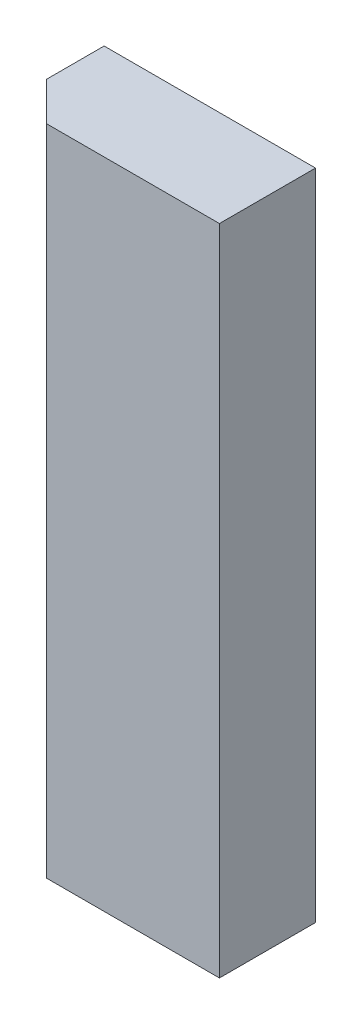
ISO-10303-21;
HEADER;
FILE_DESCRIPTION(('STEP AP214'),'2;1');
FILE_NAME('part.step','',(''),(''),'','','');
FILE_SCHEMA(('AUTOMOTIVE_DESIGN { 1 0 10303 214 1 1 1 1 }'));
ENDSEC;
DATA;
#1=APPLICATION_CONTEXT('core data for automotive mechanical design processes');
#2=APPLICATION_PROTOCOL_DEFINITION('international standard','automotive_design',2000,#1);
#3=PRODUCT_CONTEXT('',#1,'mechanical');
#4=PRODUCT('Part','Part','',(#3));
#5=PRODUCT_RELATED_PRODUCT_CATEGORY('part','',(#4));
#6=PRODUCT_DEFINITION_FORMATION('','',#4);
#7=PRODUCT_DEFINITION_CONTEXT('part definition',#1,'design');
#8=PRODUCT_DEFINITION('design','',#6,#7);
#9=PRODUCT_DEFINITION_SHAPE('','',#8);
#10=(LENGTH_UNIT() NAMED_UNIT(*) SI_UNIT(.MILLI.,.METRE.));
#11=(NAMED_UNIT(*) PLANE_ANGLE_UNIT() SI_UNIT($,.RADIAN.));
#12=(NAMED_UNIT(*) SI_UNIT($,.STERADIAN.) SOLID_ANGLE_UNIT());
#13=UNCERTAINTY_MEASURE_WITH_UNIT(LENGTH_MEASURE(1.E-05),#10,'distance_accuracy_value','');
#14=(GEOMETRIC_REPRESENTATION_CONTEXT(3) GLOBAL_UNCERTAINTY_ASSIGNED_CONTEXT((#13)) GLOBAL_UNIT_ASSIGNED_CONTEXT((#10,
#11,#12)) REPRESENTATION_CONTEXT('',''));
#15=CARTESIAN_POINT('',(0.,0.,0.));
#16=DIRECTION('',(0.,0.,1.));
#17=DIRECTION('',(1.,0.,0.));
#18=AXIS2_PLACEMENT_3D('',#15,#16,#17);
#19=CARTESIAN_POINT('',(0.,0.,25.));
#20=DIRECTION('',(0.,1.,0.));
#21=DIRECTION('',(0.,0.,1.));
#22=AXIS2_PLACEMENT_3D('',#19,#20,#21);
#23=PLANE('',#22);
#24=DIRECTION('',(1.,0.,0.));
#25=VECTOR('',#24,1.);
#26=CARTESIAN_POINT('',(0.,0.,25.));
#27=LINE('',#26,#25);
#28=CARTESIAN_POINT('',(-45.,0.,25.));
#29=VERTEX_POINT('',#28);
#30=CARTESIAN_POINT('',(0.,0.,25.));
#31=VERTEX_POINT('',#30);
#32=EDGE_CURVE('E86',#29,#31,#27,.T.);
#33=ORIENTED_EDGE('',*,*,#32,.F.);
#34=DIRECTION('',(0.707106781186547,0.,0.707106781186549));
#35=VECTOR('',#34,1.);
#36=CARTESIAN_POINT('',(-45.,0.,25.));
#37=LINE('',#36,#35);
#38=CARTESIAN_POINT('',(-55.,0.,15.));
#39=VERTEX_POINT('',#38);
#40=EDGE_CURVE('E64',#29,#39,#37,.F.);
#41=ORIENTED_EDGE('',*,*,#40,.T.);
#42=DIRECTION('',(0.,0.,-1.));
#43=VECTOR('',#42,1.);
#44=CARTESIAN_POINT('',(-55.,0.,25.));
#45=LINE('',#44,#43);
#46=CARTESIAN_POINT('',(-55.,0.,0.));
#47=VERTEX_POINT('',#46);
#48=EDGE_CURVE('E116',#39,#47,#45,.T.);
#49=ORIENTED_EDGE('',*,*,#48,.T.);
#50=DIRECTION('',(1.,0.,0.));
#51=VECTOR('',#50,1.);
#52=CARTESIAN_POINT('',(0.,0.,0.));
#53=LINE('',#52,#51);
#54=CARTESIAN_POINT('',(0.,0.,0.));
#55=VERTEX_POINT('',#54);
#56=EDGE_CURVE('E108',#47,#55,#53,.T.);
#57=ORIENTED_EDGE('',*,*,#56,.T.);
#58=DIRECTION('',(0.,0.,-1.));
#59=VECTOR('',#58,1.);
#60=CARTESIAN_POINT('',(0.,0.,25.));
#61=LINE('',#60,#59);
#62=EDGE_CURVE('E100',#31,#55,#61,.T.);
#63=ORIENTED_EDGE('',*,*,#62,.F.);
#64=EDGE_LOOP('',(#33,#41,#49,#57,#63));
#65=FACE_BOUND('',#64,.T.);
#66=ADVANCED_FACE('F41',(#65),#23,.F.);
#67=CARTESIAN_POINT('',(0.,0.,25.));
#68=DIRECTION('',(-1.,0.,0.));
#69=DIRECTION('',(0.,0.,1.));
#70=AXIS2_PLACEMENT_3D('',#67,#68,#69);
#71=PLANE('',#70);
#72=DIRECTION('',(0.,1.,0.));
#73=VECTOR('',#72,1.);
#74=CARTESIAN_POINT('',(0.,0.,0.));
#75=LINE('',#74,#73);
#76=CARTESIAN_POINT('',(0.,170.,0.));
#77=VERTEX_POINT('',#76);
#78=EDGE_CURVE('E123',#55,#77,#75,.T.);
#79=ORIENTED_EDGE('',*,*,#78,.T.);
#80=DIRECTION('',(0.,0.,-1.));
#81=VECTOR('',#80,1.);
#82=CARTESIAN_POINT('',(0.,170.,25.));
#83=LINE('',#82,#81);
#84=CARTESIAN_POINT('',(0.,170.,25.));
#85=VERTEX_POINT('',#84);
#86=EDGE_CURVE('E103',#85,#77,#83,.T.);
#87=ORIENTED_EDGE('',*,*,#86,.F.);
#88=DIRECTION('',(0.,1.,0.));
#89=VECTOR('',#88,1.);
#90=CARTESIAN_POINT('',(0.,0.,25.));
#91=LINE('',#90,#89);
#92=EDGE_CURVE('E90',#31,#85,#91,.T.);
#93=ORIENTED_EDGE('',*,*,#92,.F.);
#94=ORIENTED_EDGE('',*,*,#62,.T.);
#95=EDGE_LOOP('',(#79,#87,#93,#94));
#96=FACE_BOUND('',#95,.T.);
#97=ADVANCED_FACE('F99',(#96),#71,.F.);
#98=CARTESIAN_POINT('',(0.,170.,25.));
#99=DIRECTION('',(0.,-1.,0.));
#100=DIRECTION('',(0.,0.,-1.));
#101=AXIS2_PLACEMENT_3D('',#98,#99,#100);
#102=PLANE('',#101);
#103=DIRECTION('',(0.,0.,-1.));
#104=VECTOR('',#103,1.);
#105=CARTESIAN_POINT('',(-55.,170.,25.));
#106=LINE('',#105,#104);
#107=CARTESIAN_POINT('',(-55.,170.,15.));
#108=VERTEX_POINT('',#107);
#109=CARTESIAN_POINT('',(-55.,170.,0.));
#110=VERTEX_POINT('',#109);
#111=EDGE_CURVE('E111',#108,#110,#106,.T.);
#112=ORIENTED_EDGE('',*,*,#111,.F.);
#113=DIRECTION('',(-0.707106781186547,0.,-0.707106781186549));
#114=VECTOR('',#113,1.);
#115=CARTESIAN_POINT('',(-45.,170.,25.));
#116=LINE('',#115,#114);
#117=CARTESIAN_POINT('',(-45.,170.,25.));
#118=VERTEX_POINT('',#117);
#119=EDGE_CURVE('E11',#108,#118,#116,.F.);
#120=ORIENTED_EDGE('',*,*,#119,.T.);
#121=DIRECTION('',(-1.,0.,0.));
#122=VECTOR('',#121,1.);
#123=CARTESIAN_POINT('',(0.,170.,25.));
#124=LINE('',#123,#122);
#125=EDGE_CURVE('E105',#85,#118,#124,.T.);
#126=ORIENTED_EDGE('',*,*,#125,.F.);
#127=ORIENTED_EDGE('',*,*,#86,.T.);
#128=DIRECTION('',(-1.,0.,0.));
#129=VECTOR('',#128,1.);
#130=CARTESIAN_POINT('',(0.,170.,0.));
#131=LINE('',#130,#129);
#132=EDGE_CURVE('E120',#77,#110,#131,.T.);
#133=ORIENTED_EDGE('',*,*,#132,.T.);
#134=EDGE_LOOP('',(#112,#120,#126,#127,#133));
#135=FACE_BOUND('',#134,.T.);
#136=ADVANCED_FACE('F129',(#135),#102,.F.);
#137=CARTESIAN_POINT('',(-55.,0.,25.));
#138=DIRECTION('',(1.,0.,0.));
#139=DIRECTION('',(0.,0.,-1.));
#140=AXIS2_PLACEMENT_3D('',#137,#138,#139);
#141=PLANE('',#140);
#142=ORIENTED_EDGE('',*,*,#48,.F.);
#143=DIRECTION('',(0.,1.,0.));
#144=VECTOR('',#143,1.);
#145=CARTESIAN_POINT('',(-55.,0.,15.));
#146=LINE('',#145,#144);
#147=EDGE_CURVE('E50',#39,#108,#146,.T.);
#148=ORIENTED_EDGE('',*,*,#147,.T.);
#149=ORIENTED_EDGE('',*,*,#111,.T.);
#150=DIRECTION('',(0.,-1.,0.));
#151=VECTOR('',#150,1.);
#152=CARTESIAN_POINT('',(-55.,0.,0.));
#153=LINE('',#152,#151);
#154=EDGE_CURVE('E95',#110,#47,#153,.T.);
#155=ORIENTED_EDGE('',*,*,#154,.T.);
#156=EDGE_LOOP('',(#142,#148,#149,#155));
#157=FACE_BOUND('',#156,.T.);
#158=ADVANCED_FACE('F132',(#157),#141,.F.);
#159=CARTESIAN_POINT('',(0.,0.,25.));
#160=DIRECTION('',(0.,0.,-1.));
#161=DIRECTION('',(-1.,0.,0.));
#162=AXIS2_PLACEMENT_3D('',#159,#160,#161);
#163=PLANE('',#162);
#164=ORIENTED_EDGE('',*,*,#125,.T.);
#165=DIRECTION('',(0.,-1.,0.));
#166=VECTOR('',#165,1.);
#167=CARTESIAN_POINT('',(-45.,0.,25.));
#168=LINE('',#167,#166);
#169=EDGE_CURVE('E93',#118,#29,#168,.T.);
#170=ORIENTED_EDGE('',*,*,#169,.T.);
#171=ORIENTED_EDGE('',*,*,#32,.T.);
#172=ORIENTED_EDGE('',*,*,#92,.T.);
#173=EDGE_LOOP('',(#164,#170,#171,#172));
#174=FACE_BOUND('',#173,.T.);
#175=ADVANCED_FACE('F89',(#174),#163,.F.);
#176=CARTESIAN_POINT('',(0.,0.,0.));
#177=DIRECTION('',(0.,0.,-1.));
#178=DIRECTION('',(-1.,0.,0.));
#179=AXIS2_PLACEMENT_3D('',#176,#177,#178);
#180=PLANE('',#179);
#181=ORIENTED_EDGE('',*,*,#56,.F.);
#182=ORIENTED_EDGE('',*,*,#154,.F.);
#183=ORIENTED_EDGE('',*,*,#132,.F.);
#184=ORIENTED_EDGE('',*,*,#78,.F.);
#185=EDGE_LOOP('',(#181,#182,#183,#184));
#186=FACE_BOUND('',#185,.T.);
#187=ADVANCED_FACE('F134',(#186),#180,.T.);
#188=CARTESIAN_POINT('',(-45.,0.,25.));
#189=DIRECTION('',(0.707106781186549,0.,-0.707106781186547));
#190=DIRECTION('',(0.,-1.,0.));
#191=AXIS2_PLACEMENT_3D('',#188,#189,#190);
#192=PLANE('',#191);
#193=ORIENTED_EDGE('',*,*,#119,.F.);
#194=ORIENTED_EDGE('',*,*,#147,.F.);
#195=ORIENTED_EDGE('',*,*,#40,.F.);
#196=ORIENTED_EDGE('',*,*,#169,.F.);
#197=EDGE_LOOP('',(#193,#194,#195,#196));
#198=FACE_BOUND('',#197,.T.);
#199=ADVANCED_FACE('F44',(#198),#192,.F.);
#200=CLOSED_SHELL('',(#66,#97,#136,#158,#175,#187,#199));
#201=MANIFOLD_SOLID_BREP('B2',#200);
#202=ADVANCED_BREP_SHAPE_REPRESENTATION('',(#18,#201),#14);
#203=SHAPE_DEFINITION_REPRESENTATION(#9,#202);
ENDSEC;
END-ISO-10303-21;
